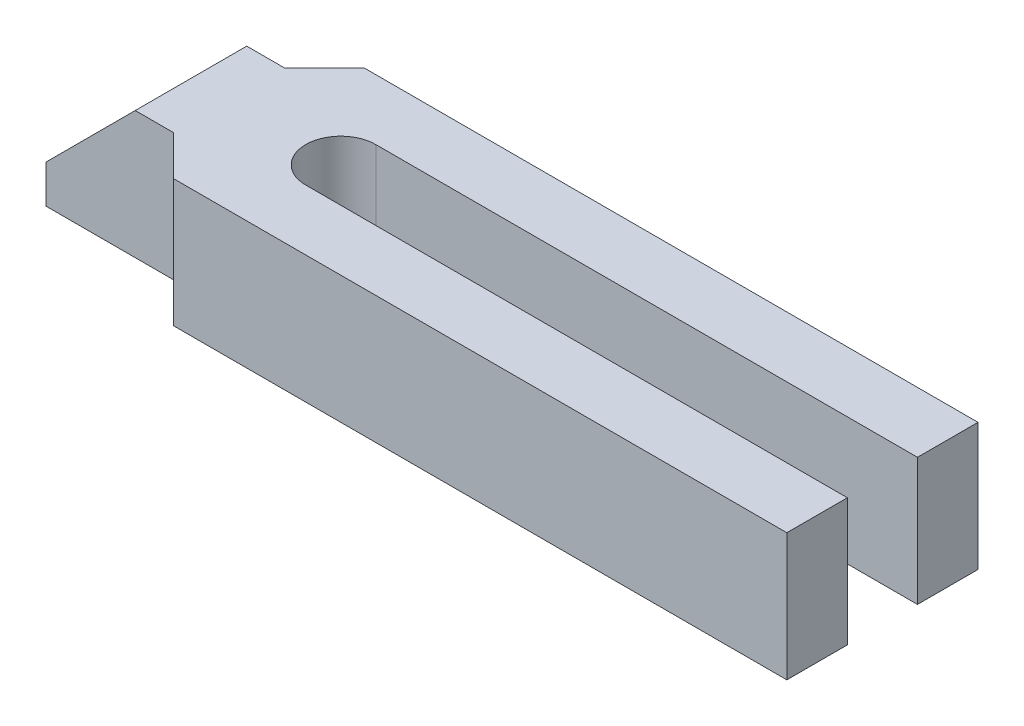
ISO-10303-21;
HEADER;
FILE_DESCRIPTION(('STEP AP214'),'2;1');
FILE_NAME('part.step','',(''),(''),'','','');
FILE_SCHEMA(('AUTOMOTIVE_DESIGN { 1 0 10303 214 1 1 1 1 }'));
ENDSEC;
DATA;
#1=APPLICATION_CONTEXT('core data for automotive mechanical design processes');
#2=APPLICATION_PROTOCOL_DEFINITION('international standard','automotive_design',2000,#1);
#3=PRODUCT_CONTEXT('',#1,'mechanical');
#4=PRODUCT('Part','Part','',(#3));
#5=PRODUCT_RELATED_PRODUCT_CATEGORY('part','',(#4));
#6=PRODUCT_DEFINITION_FORMATION('','',#4);
#7=PRODUCT_DEFINITION_CONTEXT('part definition',#1,'design');
#8=PRODUCT_DEFINITION('design','',#6,#7);
#9=PRODUCT_DEFINITION_SHAPE('','',#8);
#10=(LENGTH_UNIT() NAMED_UNIT(*) SI_UNIT(.MILLI.,.METRE.));
#11=(NAMED_UNIT(*) PLANE_ANGLE_UNIT() SI_UNIT($,.RADIAN.));
#12=(NAMED_UNIT(*) SI_UNIT($,.STERADIAN.) SOLID_ANGLE_UNIT());
#13=UNCERTAINTY_MEASURE_WITH_UNIT(LENGTH_MEASURE(1.E-05),#10,'distance_accuracy_value','');
#14=(GEOMETRIC_REPRESENTATION_CONTEXT(3) GLOBAL_UNCERTAINTY_ASSIGNED_CONTEXT((#13)) GLOBAL_UNIT_ASSIGNED_CONTEXT((#10,
#11,#12)) REPRESENTATION_CONTEXT('',''));
#15=CARTESIAN_POINT('',(0.,0.,0.));
#16=DIRECTION('',(0.,0.,1.));
#17=DIRECTION('',(1.,0.,0.));
#18=AXIS2_PLACEMENT_3D('',#15,#16,#17);
#19=CARTESIAN_POINT('',(0.,40.,17.5));
#20=DIRECTION('',(-1.,0.,0.));
#21=DIRECTION('',(0.,0.,1.));
#22=AXIS2_PLACEMENT_3D('',#19,#20,#21);
#23=PLANE('',#22);
#24=DIRECTION('',(0.,-1.,0.));
#25=VECTOR('',#24,1.);
#26=CARTESIAN_POINT('',(0.,40.,17.5));
#27=LINE('',#26,#25);
#28=CARTESIAN_POINT('',(0.,12.,17.5));
#29=VERTEX_POINT('',#28);
#30=CARTESIAN_POINT('',(0.,0.,17.5));
#31=VERTEX_POINT('',#30);
#32=EDGE_CURVE('E208',#29,#31,#27,.T.);
#33=ORIENTED_EDGE('',*,*,#32,.F.);
#34=DIRECTION('',(0.,0.,-1.));
#35=VECTOR('',#34,1.);
#36=CARTESIAN_POINT('',(0.,12.,-17.5));
#37=LINE('',#36,#35);
#38=CARTESIAN_POINT('',(0.,12.,-17.5));
#39=VERTEX_POINT('',#38);
#40=EDGE_CURVE('E210',#29,#39,#37,.T.);
#41=ORIENTED_EDGE('',*,*,#40,.T.);
#42=DIRECTION('',(0.,-1.,0.));
#43=VECTOR('',#42,1.);
#44=CARTESIAN_POINT('',(0.,40.,-17.5));
#45=LINE('',#44,#43);
#46=CARTESIAN_POINT('',(0.,0.,-17.5));
#47=VERTEX_POINT('',#46);
#48=EDGE_CURVE('E144',#39,#47,#45,.T.);
#49=ORIENTED_EDGE('',*,*,#48,.T.);
#50=DIRECTION('',(0.,0.,-1.));
#51=VECTOR('',#50,1.);
#52=CARTESIAN_POINT('',(0.,0.,17.5));
#53=LINE('',#52,#51);
#54=EDGE_CURVE('E135',#31,#47,#53,.T.);
#55=ORIENTED_EDGE('',*,*,#54,.F.);
#56=EDGE_LOOP('',(#33,#41,#49,#55));
#57=FACE_BOUND('',#56,.T.);
#58=ADVANCED_FACE('F36',(#57),#23,.T.);
#59=CARTESIAN_POINT('',(40.,40.,17.5));
#60=DIRECTION('',(0.,0.,1.));
#61=DIRECTION('',(1.,0.,0.));
#62=AXIS2_PLACEMENT_3D('',#59,#60,#61);
#63=PLANE('',#62);
#64=DIRECTION('',(-1.,0.,0.));
#65=VECTOR('',#64,1.);
#66=CARTESIAN_POINT('',(40.,40.,17.5));
#67=LINE('',#66,#65);
#68=CARTESIAN_POINT('',(40.,40.,17.5));
#69=VERTEX_POINT('',#68);
#70=CARTESIAN_POINT('',(28.0000000000001,40.,17.5));
#71=VERTEX_POINT('',#70);
#72=EDGE_CURVE('E174',#69,#71,#67,.T.);
#73=ORIENTED_EDGE('',*,*,#72,.T.);
#74=DIRECTION('',(-0.707106781186549,-0.707106781186546,0.));
#75=VECTOR('',#74,1.);
#76=CARTESIAN_POINT('',(34.,45.9999999999999,17.5));
#77=LINE('',#76,#75);
#78=EDGE_CURVE('E11',#71,#29,#77,.T.);
#79=ORIENTED_EDGE('',*,*,#78,.T.);
#80=ORIENTED_EDGE('',*,*,#32,.T.);
#81=DIRECTION('',(-1.,0.,0.));
#82=VECTOR('',#81,1.);
#83=CARTESIAN_POINT('',(40.,0.,17.5));
#84=LINE('',#83,#82);
#85=CARTESIAN_POINT('',(40.,0.,17.5));
#86=VERTEX_POINT('',#85);
#87=EDGE_CURVE('E203',#86,#31,#84,.T.);
#88=ORIENTED_EDGE('',*,*,#87,.F.);
#89=DIRECTION('',(0.,-1.,0.));
#90=VECTOR('',#89,1.);
#91=CARTESIAN_POINT('',(40.,40.,17.5));
#92=LINE('',#91,#90);
#93=EDGE_CURVE('E211',#69,#86,#92,.T.);
#94=ORIENTED_EDGE('',*,*,#93,.F.);
#95=EDGE_LOOP('',(#73,#79,#80,#88,#94));
#96=FACE_BOUND('',#95,.T.);
#97=ADVANCED_FACE('F242',(#96),#63,.T.);
#98=CARTESIAN_POINT('',(52.5,40.,30.));
#99=DIRECTION('',(-0.707106781186548,0.,0.707106781186547));
#100=DIRECTION('',(0.707106781186547,0.,0.707106781186548));
#101=AXIS2_PLACEMENT_3D('',#98,#99,#100);
#102=PLANE('',#101);
#103=DIRECTION('',(-0.707106781186547,0.,-0.707106781186548));
#104=VECTOR('',#103,1.);
#105=CARTESIAN_POINT('',(52.5,0.,30.));
#106=LINE('',#105,#104);
#107=CARTESIAN_POINT('',(52.5,0.,30.));
#108=VERTEX_POINT('',#107);
#109=EDGE_CURVE('E200',#108,#86,#106,.T.);
#110=ORIENTED_EDGE('',*,*,#109,.F.);
#111=DIRECTION('',(0.,-1.,0.));
#112=VECTOR('',#111,1.);
#113=CARTESIAN_POINT('',(52.5,40.,30.));
#114=LINE('',#113,#112);
#115=CARTESIAN_POINT('',(52.5,40.,30.));
#116=VERTEX_POINT('',#115);
#117=EDGE_CURVE('E213',#116,#108,#114,.T.);
#118=ORIENTED_EDGE('',*,*,#117,.F.);
#119=DIRECTION('',(-0.707106781186547,0.,-0.707106781186548));
#120=VECTOR('',#119,1.);
#121=CARTESIAN_POINT('',(52.5,40.,30.));
#122=LINE('',#121,#120);
#123=EDGE_CURVE('E171',#116,#69,#122,.T.);
#124=ORIENTED_EDGE('',*,*,#123,.T.);
#125=ORIENTED_EDGE('',*,*,#93,.T.);
#126=EDGE_LOOP('',(#110,#118,#124,#125));
#127=FACE_BOUND('',#126,.T.);
#128=ADVANCED_FACE('F253',(#127),#102,.T.);
#129=CARTESIAN_POINT('',(245.,40.,30.));
#130=DIRECTION('',(0.,0.,1.));
#131=DIRECTION('',(1.,0.,0.));
#132=AXIS2_PLACEMENT_3D('',#129,#130,#131);
#133=PLANE('',#132);
#134=DIRECTION('',(-1.,0.,0.));
#135=VECTOR('',#134,1.);
#136=CARTESIAN_POINT('',(245.,0.,30.));
#137=LINE('',#136,#135);
#138=CARTESIAN_POINT('',(245.,0.,30.));
#139=VERTEX_POINT('',#138);
#140=EDGE_CURVE('E197',#139,#108,#137,.T.);
#141=ORIENTED_EDGE('',*,*,#140,.F.);
#142=DIRECTION('',(0.,-1.,0.));
#143=VECTOR('',#142,1.);
#144=CARTESIAN_POINT('',(245.,40.,30.));
#145=LINE('',#144,#143);
#146=CARTESIAN_POINT('',(245.,40.,30.));
#147=VERTEX_POINT('',#146);
#148=EDGE_CURVE('E215',#147,#139,#145,.T.);
#149=ORIENTED_EDGE('',*,*,#148,.F.);
#150=DIRECTION('',(-1.,0.,0.));
#151=VECTOR('',#150,1.);
#152=CARTESIAN_POINT('',(245.,40.,30.));
#153=LINE('',#152,#151);
#154=EDGE_CURVE('E168',#147,#116,#153,.T.);
#155=ORIENTED_EDGE('',*,*,#154,.T.);
#156=ORIENTED_EDGE('',*,*,#117,.T.);
#157=EDGE_LOOP('',(#141,#149,#155,#156));
#158=FACE_BOUND('',#157,.T.);
#159=ADVANCED_FACE('F259',(#158),#133,.T.);
#160=CARTESIAN_POINT('',(245.,40.,11.));
#161=DIRECTION('',(1.,0.,0.));
#162=DIRECTION('',(0.,0.,-1.));
#163=AXIS2_PLACEMENT_3D('',#160,#161,#162);
#164=PLANE('',#163);
#165=DIRECTION('',(0.,0.,1.));
#166=VECTOR('',#165,1.);
#167=CARTESIAN_POINT('',(245.,0.,11.));
#168=LINE('',#167,#166);
#169=CARTESIAN_POINT('',(245.,0.,11.));
#170=VERTEX_POINT('',#169);
#171=EDGE_CURVE('E194',#170,#139,#168,.T.);
#172=ORIENTED_EDGE('',*,*,#171,.F.);
#173=DIRECTION('',(0.,-1.,0.));
#174=VECTOR('',#173,1.);
#175=CARTESIAN_POINT('',(245.,40.,11.));
#176=LINE('',#175,#174);
#177=CARTESIAN_POINT('',(245.,40.,11.));
#178=VERTEX_POINT('',#177);
#179=EDGE_CURVE('E217',#178,#170,#176,.T.);
#180=ORIENTED_EDGE('',*,*,#179,.F.);
#181=DIRECTION('',(0.,0.,1.));
#182=VECTOR('',#181,1.);
#183=CARTESIAN_POINT('',(245.,40.,11.));
#184=LINE('',#183,#182);
#185=EDGE_CURVE('E165',#178,#147,#184,.T.);
#186=ORIENTED_EDGE('',*,*,#185,.T.);
#187=ORIENTED_EDGE('',*,*,#148,.T.);
#188=EDGE_LOOP('',(#172,#180,#186,#187));
#189=FACE_BOUND('',#188,.T.);
#190=ADVANCED_FACE('F263',(#189),#164,.T.);
#191=CARTESIAN_POINT('',(75.,40.,11.));
#192=DIRECTION('',(0.,0.,-1.));
#193=DIRECTION('',(-1.,0.,0.));
#194=AXIS2_PLACEMENT_3D('',#191,#192,#193);
#195=PLANE('',#194);
#196=DIRECTION('',(1.,0.,0.));
#197=VECTOR('',#196,1.);
#198=CARTESIAN_POINT('',(75.,0.,11.));
#199=LINE('',#198,#197);
#200=CARTESIAN_POINT('',(75.,0.,11.));
#201=VERTEX_POINT('',#200);
#202=EDGE_CURVE('E191',#201,#170,#199,.T.);
#203=ORIENTED_EDGE('',*,*,#202,.F.);
#204=DIRECTION('',(0.,-1.,0.));
#205=VECTOR('',#204,1.);
#206=CARTESIAN_POINT('',(75.,40.,11.));
#207=LINE('',#206,#205);
#208=CARTESIAN_POINT('',(75.,40.,11.));
#209=VERTEX_POINT('',#208);
#210=EDGE_CURVE('E219',#209,#201,#207,.T.);
#211=ORIENTED_EDGE('',*,*,#210,.F.);
#212=DIRECTION('',(1.,0.,0.));
#213=VECTOR('',#212,1.);
#214=CARTESIAN_POINT('',(75.,40.,11.));
#215=LINE('',#214,#213);
#216=EDGE_CURVE('E162',#209,#178,#215,.T.);
#217=ORIENTED_EDGE('',*,*,#216,.T.);
#218=ORIENTED_EDGE('',*,*,#179,.T.);
#219=EDGE_LOOP('',(#203,#211,#217,#218));
#220=FACE_BOUND('',#219,.T.);
#221=ADVANCED_FACE('F267',(#220),#195,.T.);
#222=CARTESIAN_POINT('',(75.,40.,0.));
#223=DIRECTION('',(0.,-1.,0.));
#224=DIRECTION('',(0.,0.,-1.));
#225=AXIS2_PLACEMENT_3D('',#222,#223,#224);
#226=CYLINDRICAL_SURFACE('',#225,11.);
#227=CARTESIAN_POINT('',(75.,0.,0.));
#228=DIRECTION('',(0.,-1.,0.));
#229=DIRECTION('',(0.,0.,-1.));
#230=AXIS2_PLACEMENT_3D('',#227,#228,#229);
#231=CIRCLE('',#230,11.);
#232=CARTESIAN_POINT('',(75.,0.,-11.));
#233=VERTEX_POINT('',#232);
#234=EDGE_CURVE('E188',#201,#233,#231,.T.);
#235=ORIENTED_EDGE('',*,*,#234,.T.);
#236=DIRECTION('',(0.,-1.,0.));
#237=VECTOR('',#236,1.);
#238=CARTESIAN_POINT('',(75.,40.,-11.));
#239=LINE('',#238,#237);
#240=CARTESIAN_POINT('',(75.,40.,-11.));
#241=VERTEX_POINT('',#240);
#242=EDGE_CURVE('E221',#241,#233,#239,.T.);
#243=ORIENTED_EDGE('',*,*,#242,.F.);
#244=CARTESIAN_POINT('',(75.,40.,0.));
#245=DIRECTION('',(0.,-1.,0.));
#246=DIRECTION('',(0.,0.,-1.));
#247=AXIS2_PLACEMENT_3D('',#244,#245,#246);
#248=CIRCLE('',#247,11.);
#249=EDGE_CURVE('E160',#209,#241,#248,.T.);
#250=ORIENTED_EDGE('',*,*,#249,.F.);
#251=ORIENTED_EDGE('',*,*,#210,.T.);
#252=EDGE_LOOP('',(#235,#243,#250,#251));
#253=FACE_BOUND('',#252,.T.);
#254=ADVANCED_FACE('F271',(#253),#226,.F.);
#255=CARTESIAN_POINT('',(245.,40.,-11.));
#256=DIRECTION('',(0.,0.,1.));
#257=DIRECTION('',(1.,0.,0.));
#258=AXIS2_PLACEMENT_3D('',#255,#256,#257);
#259=PLANE('',#258);
#260=DIRECTION('',(-1.,0.,0.));
#261=VECTOR('',#260,1.);
#262=CARTESIAN_POINT('',(245.,0.,-11.));
#263=LINE('',#262,#261);
#264=CARTESIAN_POINT('',(245.,0.,-11.));
#265=VERTEX_POINT('',#264);
#266=EDGE_CURVE('E185',#265,#233,#263,.T.);
#267=ORIENTED_EDGE('',*,*,#266,.F.);
#268=DIRECTION('',(0.,-1.,0.));
#269=VECTOR('',#268,1.);
#270=CARTESIAN_POINT('',(245.,40.,-11.));
#271=LINE('',#270,#269);
#272=CARTESIAN_POINT('',(245.,40.,-11.));
#273=VERTEX_POINT('',#272);
#274=EDGE_CURVE('E223',#273,#265,#271,.T.);
#275=ORIENTED_EDGE('',*,*,#274,.F.);
#276=DIRECTION('',(-1.,0.,0.));
#277=VECTOR('',#276,1.);
#278=CARTESIAN_POINT('',(245.,40.,-11.));
#279=LINE('',#278,#277);
#280=EDGE_CURVE('E157',#273,#241,#279,.T.);
#281=ORIENTED_EDGE('',*,*,#280,.T.);
#282=ORIENTED_EDGE('',*,*,#242,.T.);
#283=EDGE_LOOP('',(#267,#275,#281,#282));
#284=FACE_BOUND('',#283,.T.);
#285=ADVANCED_FACE('F275',(#284),#259,.T.);
#286=CARTESIAN_POINT('',(245.,40.,-30.));
#287=DIRECTION('',(1.,0.,0.));
#288=DIRECTION('',(0.,0.,-1.));
#289=AXIS2_PLACEMENT_3D('',#286,#287,#288);
#290=PLANE('',#289);
#291=DIRECTION('',(0.,0.,1.));
#292=VECTOR('',#291,1.);
#293=CARTESIAN_POINT('',(245.,0.,-30.));
#294=LINE('',#293,#292);
#295=CARTESIAN_POINT('',(245.,0.,-30.));
#296=VERTEX_POINT('',#295);
#297=EDGE_CURVE('E182',#296,#265,#294,.T.);
#298=ORIENTED_EDGE('',*,*,#297,.F.);
#299=DIRECTION('',(0.,-1.,0.));
#300=VECTOR('',#299,1.);
#301=CARTESIAN_POINT('',(245.,40.,-30.));
#302=LINE('',#301,#300);
#303=CARTESIAN_POINT('',(245.,40.,-30.));
#304=VERTEX_POINT('',#303);
#305=EDGE_CURVE('E225',#304,#296,#302,.T.);
#306=ORIENTED_EDGE('',*,*,#305,.F.);
#307=DIRECTION('',(0.,0.,1.));
#308=VECTOR('',#307,1.);
#309=CARTESIAN_POINT('',(245.,40.,-30.));
#310=LINE('',#309,#308);
#311=EDGE_CURVE('E152',#304,#273,#310,.T.);
#312=ORIENTED_EDGE('',*,*,#311,.T.);
#313=ORIENTED_EDGE('',*,*,#274,.T.);
#314=EDGE_LOOP('',(#298,#306,#312,#313));
#315=FACE_BOUND('',#314,.T.);
#316=ADVANCED_FACE('F279',(#315),#290,.T.);
#317=CARTESIAN_POINT('',(52.5,40.,-30.));
#318=DIRECTION('',(0.,0.,-1.));
#319=DIRECTION('',(-1.,0.,0.));
#320=AXIS2_PLACEMENT_3D('',#317,#318,#319);
#321=PLANE('',#320);
#322=DIRECTION('',(1.,0.,0.));
#323=VECTOR('',#322,1.);
#324=CARTESIAN_POINT('',(52.5,0.,-30.));
#325=LINE('',#324,#323);
#326=CARTESIAN_POINT('',(52.5,0.,-30.));
#327=VERTEX_POINT('',#326);
#328=EDGE_CURVE('E179',#327,#296,#325,.T.);
#329=ORIENTED_EDGE('',*,*,#328,.F.);
#330=DIRECTION('',(0.,-1.,0.));
#331=VECTOR('',#330,1.);
#332=CARTESIAN_POINT('',(52.5,40.,-30.));
#333=LINE('',#332,#331);
#334=CARTESIAN_POINT('',(52.5,40.,-30.));
#335=VERTEX_POINT('',#334);
#336=EDGE_CURVE('E143',#335,#327,#333,.T.);
#337=ORIENTED_EDGE('',*,*,#336,.F.);
#338=DIRECTION('',(1.,0.,0.));
#339=VECTOR('',#338,1.);
#340=CARTESIAN_POINT('',(52.5,40.,-30.));
#341=LINE('',#340,#339);
#342=EDGE_CURVE('E150',#335,#304,#341,.T.);
#343=ORIENTED_EDGE('',*,*,#342,.T.);
#344=ORIENTED_EDGE('',*,*,#305,.T.);
#345=EDGE_LOOP('',(#329,#337,#343,#344));
#346=FACE_BOUND('',#345,.T.);
#347=ADVANCED_FACE('F283',(#346),#321,.T.);
#348=CARTESIAN_POINT('',(40.,40.,-17.5));
#349=DIRECTION('',(-0.707106781186548,0.,-0.707106781186547));
#350=DIRECTION('',(-0.707106781186547,0.,0.707106781186548));
#351=AXIS2_PLACEMENT_3D('',#348,#349,#350);
#352=PLANE('',#351);
#353=DIRECTION('',(0.707106781186547,0.,-0.707106781186548));
#354=VECTOR('',#353,1.);
#355=CARTESIAN_POINT('',(40.,0.,-17.5));
#356=LINE('',#355,#354);
#357=CARTESIAN_POINT('',(40.,0.,-17.5));
#358=VERTEX_POINT('',#357);
#359=EDGE_CURVE('E141',#358,#327,#356,.T.);
#360=ORIENTED_EDGE('',*,*,#359,.F.);
#361=DIRECTION('',(0.,-1.,0.));
#362=VECTOR('',#361,1.);
#363=CARTESIAN_POINT('',(40.,40.,-17.5));
#364=LINE('',#363,#362);
#365=CARTESIAN_POINT('',(40.,40.,-17.5));
#366=VERTEX_POINT('',#365);
#367=EDGE_CURVE('E131',#366,#358,#364,.T.);
#368=ORIENTED_EDGE('',*,*,#367,.F.);
#369=DIRECTION('',(0.707106781186547,0.,-0.707106781186548));
#370=VECTOR('',#369,1.);
#371=CARTESIAN_POINT('',(40.,40.,-17.5));
#372=LINE('',#371,#370);
#373=EDGE_CURVE('E134',#366,#335,#372,.T.);
#374=ORIENTED_EDGE('',*,*,#373,.T.);
#375=ORIENTED_EDGE('',*,*,#336,.T.);
#376=EDGE_LOOP('',(#360,#368,#374,#375));
#377=FACE_BOUND('',#376,.T.);
#378=ADVANCED_FACE('F139',(#377),#352,.T.);
#379=CARTESIAN_POINT('',(0.,40.,-17.5));
#380=DIRECTION('',(0.,0.,-1.));
#381=DIRECTION('',(-1.,0.,0.));
#382=AXIS2_PLACEMENT_3D('',#379,#380,#381);
#383=PLANE('',#382);
#384=ORIENTED_EDGE('',*,*,#48,.F.);
#385=DIRECTION('',(0.707106781186549,0.707106781186546,0.));
#386=VECTOR('',#385,1.);
#387=CARTESIAN_POINT('',(14.,25.9999999999999,-17.5));
#388=LINE('',#387,#386);
#389=CARTESIAN_POINT('',(28.0000000000001,40.,-17.5));
#390=VERTEX_POINT('',#389);
#391=EDGE_CURVE('E58',#39,#390,#388,.T.);
#392=ORIENTED_EDGE('',*,*,#391,.T.);
#393=DIRECTION('',(1.,0.,0.));
#394=VECTOR('',#393,1.);
#395=CARTESIAN_POINT('',(0.,40.,-17.5));
#396=LINE('',#395,#394);
#397=EDGE_CURVE('E127',#390,#366,#396,.T.);
#398=ORIENTED_EDGE('',*,*,#397,.T.);
#399=ORIENTED_EDGE('',*,*,#367,.T.);
#400=DIRECTION('',(1.,0.,0.));
#401=VECTOR('',#400,1.);
#402=CARTESIAN_POINT('',(0.,0.,-17.5));
#403=LINE('',#402,#401);
#404=EDGE_CURVE('E176',#47,#358,#403,.T.);
#405=ORIENTED_EDGE('',*,*,#404,.F.);
#406=EDGE_LOOP('',(#384,#392,#398,#399,#405));
#407=FACE_BOUND('',#406,.T.);
#408=ADVANCED_FACE('F129',(#407),#383,.T.);
#409=CARTESIAN_POINT('',(75.,40.,0.));
#410=DIRECTION('',(0.,-1.,0.));
#411=DIRECTION('',(0.,0.,-1.));
#412=AXIS2_PLACEMENT_3D('',#409,#410,#411);
#413=PLANE('',#412);
#414=ORIENTED_EDGE('',*,*,#397,.F.);
#415=DIRECTION('',(0.,0.,1.));
#416=VECTOR('',#415,1.);
#417=CARTESIAN_POINT('',(28.0000000000001,40.,17.5));
#418=LINE('',#417,#416);
#419=EDGE_CURVE('E44',#390,#71,#418,.T.);
#420=ORIENTED_EDGE('',*,*,#419,.T.);
#421=ORIENTED_EDGE('',*,*,#72,.F.);
#422=ORIENTED_EDGE('',*,*,#123,.F.);
#423=ORIENTED_EDGE('',*,*,#154,.F.);
#424=ORIENTED_EDGE('',*,*,#185,.F.);
#425=ORIENTED_EDGE('',*,*,#216,.F.);
#426=ORIENTED_EDGE('',*,*,#249,.T.);
#427=ORIENTED_EDGE('',*,*,#280,.F.);
#428=ORIENTED_EDGE('',*,*,#311,.F.);
#429=ORIENTED_EDGE('',*,*,#342,.F.);
#430=ORIENTED_EDGE('',*,*,#373,.F.);
#431=EDGE_LOOP('',(#414,#420,#421,#422,#423,#424,#425,#426,#427,#428,#429,#430));
#432=FACE_BOUND('',#431,.T.);
#433=ADVANCED_FACE('F147',(#432),#413,.F.);
#434=CARTESIAN_POINT('',(75.,0.,0.));
#435=DIRECTION('',(0.,-1.,0.));
#436=DIRECTION('',(0.,0.,-1.));
#437=AXIS2_PLACEMENT_3D('',#434,#435,#436);
#438=PLANE('',#437);
#439=ORIENTED_EDGE('',*,*,#54,.T.);
#440=ORIENTED_EDGE('',*,*,#404,.T.);
#441=ORIENTED_EDGE('',*,*,#359,.T.);
#442=ORIENTED_EDGE('',*,*,#328,.T.);
#443=ORIENTED_EDGE('',*,*,#297,.T.);
#444=ORIENTED_EDGE('',*,*,#266,.T.);
#445=ORIENTED_EDGE('',*,*,#234,.F.);
#446=ORIENTED_EDGE('',*,*,#202,.T.);
#447=ORIENTED_EDGE('',*,*,#171,.T.);
#448=ORIENTED_EDGE('',*,*,#140,.T.);
#449=ORIENTED_EDGE('',*,*,#109,.T.);
#450=ORIENTED_EDGE('',*,*,#87,.T.);
#451=EDGE_LOOP('',(#439,#440,#441,#442,#443,#444,#445,#446,#447,#448,#449,#450));
#452=FACE_BOUND('',#451,.T.);
#453=ADVANCED_FACE('F238',(#452),#438,.T.);
#454=CARTESIAN_POINT('',(0.,12.,17.5));
#455=DIRECTION('',(-0.707106781186546,0.707106781186549,0.));
#456=DIRECTION('',(0.,0.,1.));
#457=AXIS2_PLACEMENT_3D('',#454,#455,#456);
#458=PLANE('',#457);
#459=ORIENTED_EDGE('',*,*,#78,.F.);
#460=ORIENTED_EDGE('',*,*,#419,.F.);
#461=ORIENTED_EDGE('',*,*,#391,.F.);
#462=ORIENTED_EDGE('',*,*,#40,.F.);
#463=EDGE_LOOP('',(#459,#460,#461,#462));
#464=FACE_BOUND('',#463,.T.);
#465=ADVANCED_FACE('F38',(#464),#458,.T.);
#466=CLOSED_SHELL('',(#58,#97,#128,#159,#190,#221,#254,#285,#316,#347,#378,#408,#433,#453,#465));
#467=MANIFOLD_SOLID_BREP('B2',#466);
#468=ADVANCED_BREP_SHAPE_REPRESENTATION('',(#18,#467),#14);
#469=SHAPE_DEFINITION_REPRESENTATION(#9,#468);
ENDSEC;
END-ISO-10303-21;
